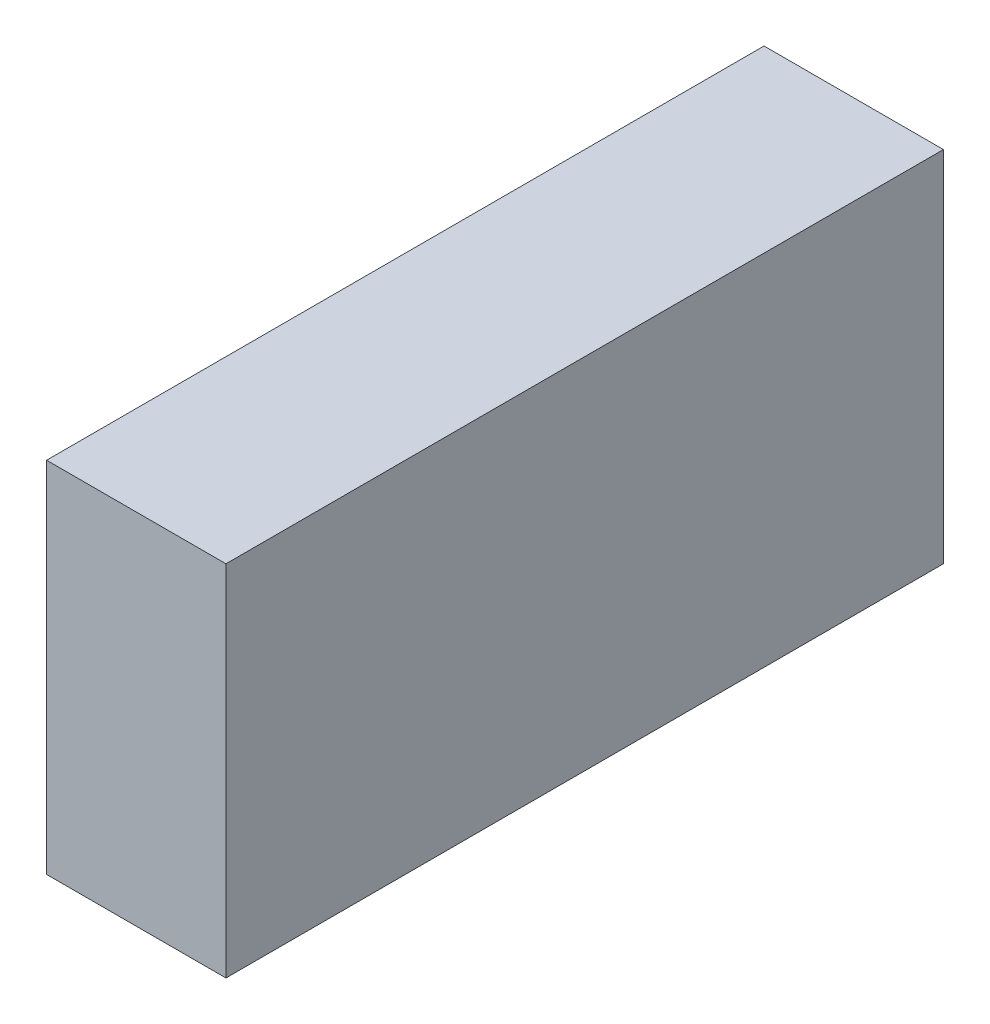
ISO-10303-21;
HEADER;
FILE_DESCRIPTION(('STEP AP214'),'2;1');
FILE_NAME('part.step','',(''),(''),'','','');
FILE_SCHEMA(('AUTOMOTIVE_DESIGN { 1 0 10303 214 1 1 1 1 }'));
ENDSEC;
DATA;
#1=APPLICATION_CONTEXT('core data for automotive mechanical design processes');
#2=APPLICATION_PROTOCOL_DEFINITION('international standard','automotive_design',2000,#1);
#3=PRODUCT_CONTEXT('',#1,'mechanical');
#4=PRODUCT('Part','Part','',(#3));
#5=PRODUCT_RELATED_PRODUCT_CATEGORY('part','',(#4));
#6=PRODUCT_DEFINITION_FORMATION('','',#4);
#7=PRODUCT_DEFINITION_CONTEXT('part definition',#1,'design');
#8=PRODUCT_DEFINITION('design','',#6,#7);
#9=PRODUCT_DEFINITION_SHAPE('','',#8);
#10=(LENGTH_UNIT() NAMED_UNIT(*) SI_UNIT(.MILLI.,.METRE.));
#11=(NAMED_UNIT(*) PLANE_ANGLE_UNIT() SI_UNIT($,.RADIAN.));
#12=(NAMED_UNIT(*) SI_UNIT($,.STERADIAN.) SOLID_ANGLE_UNIT());
#13=UNCERTAINTY_MEASURE_WITH_UNIT(LENGTH_MEASURE(1.E-05),#10,'distance_accuracy_value','');
#14=(GEOMETRIC_REPRESENTATION_CONTEXT(3) GLOBAL_UNCERTAINTY_ASSIGNED_CONTEXT((#13)) GLOBAL_UNIT_ASSIGNED_CONTEXT((#10,
#11,#12)) REPRESENTATION_CONTEXT('',''));
#15=CARTESIAN_POINT('',(0.,0.,0.));
#16=DIRECTION('',(0.,0.,1.));
#17=DIRECTION('',(1.,0.,0.));
#18=AXIS2_PLACEMENT_3D('',#15,#16,#17);
#19=CARTESIAN_POINT('',(3.175,9.525,12.7));
#20=DIRECTION('',(-1.,0.,0.));
#21=DIRECTION('',(0.,0.,1.));
#22=AXIS2_PLACEMENT_3D('',#19,#20,#21);
#23=PLANE('',#22);
#24=DIRECTION('',(0.,1.,0.));
#25=VECTOR('',#24,1.);
#26=CARTESIAN_POINT('',(3.175,9.525,-12.7));
#27=LINE('',#26,#25);
#28=CARTESIAN_POINT('',(3.175,9.525,-12.7));
#29=VERTEX_POINT('',#28);
#30=CARTESIAN_POINT('',(3.175,22.225,-12.7));
#31=VERTEX_POINT('',#30);
#32=EDGE_CURVE('E96',#29,#31,#27,.T.);
#33=ORIENTED_EDGE('',*,*,#32,.T.);
#34=DIRECTION('',(0.,0.,-1.));
#35=VECTOR('',#34,1.);
#36=CARTESIAN_POINT('',(3.175,22.225,12.7));
#37=LINE('',#36,#35);
#38=CARTESIAN_POINT('',(3.175,22.225,12.7));
#39=VERTEX_POINT('',#38);
#40=EDGE_CURVE('E11',#39,#31,#37,.T.);
#41=ORIENTED_EDGE('',*,*,#40,.F.);
#42=DIRECTION('',(0.,1.,0.));
#43=VECTOR('',#42,1.);
#44=CARTESIAN_POINT('',(3.175,9.525,12.7));
#45=LINE('',#44,#43);
#46=CARTESIAN_POINT('',(3.175,9.525,12.7));
#47=VERTEX_POINT('',#46);
#48=EDGE_CURVE('E84',#47,#39,#45,.T.);
#49=ORIENTED_EDGE('',*,*,#48,.F.);
#50=DIRECTION('',(0.,0.,-1.));
#51=VECTOR('',#50,1.);
#52=CARTESIAN_POINT('',(3.175,9.525,12.7));
#53=LINE('',#52,#51);
#54=EDGE_CURVE('E92',#47,#29,#53,.T.);
#55=ORIENTED_EDGE('',*,*,#54,.T.);
#56=EDGE_LOOP('',(#33,#41,#49,#55));
#57=FACE_BOUND('',#56,.T.);
#58=ADVANCED_FACE('F33',(#57),#23,.F.);
#59=CARTESIAN_POINT('',(-3.175,22.225,12.7));
#60=DIRECTION('',(0.,-1.,0.));
#61=DIRECTION('',(0.,0.,-1.));
#62=AXIS2_PLACEMENT_3D('',#59,#60,#61);
#63=PLANE('',#62);
#64=DIRECTION('',(-1.,0.,0.));
#65=VECTOR('',#64,1.);
#66=CARTESIAN_POINT('',(-3.175,22.225,-12.7));
#67=LINE('',#66,#65);
#68=CARTESIAN_POINT('',(-3.175,22.225,-12.7));
#69=VERTEX_POINT('',#68);
#70=EDGE_CURVE('E88',#31,#69,#67,.T.);
#71=ORIENTED_EDGE('',*,*,#70,.T.);
#72=DIRECTION('',(0.,0.,-1.));
#73=VECTOR('',#72,1.);
#74=CARTESIAN_POINT('',(-3.175,22.225,12.7));
#75=LINE('',#74,#73);
#76=CARTESIAN_POINT('',(-3.175,22.225,12.7));
#77=VERTEX_POINT('',#76);
#78=EDGE_CURVE('E41',#77,#69,#75,.T.);
#79=ORIENTED_EDGE('',*,*,#78,.F.);
#80=DIRECTION('',(-1.,0.,0.));
#81=VECTOR('',#80,1.);
#82=CARTESIAN_POINT('',(-3.175,22.225,12.7));
#83=LINE('',#82,#81);
#84=EDGE_CURVE('E79',#39,#77,#83,.T.);
#85=ORIENTED_EDGE('',*,*,#84,.F.);
#86=ORIENTED_EDGE('',*,*,#40,.T.);
#87=EDGE_LOOP('',(#71,#79,#85,#86));
#88=FACE_BOUND('',#87,.T.);
#89=ADVANCED_FACE('F87',(#88),#63,.F.);
#90=CARTESIAN_POINT('',(-3.175,9.525,12.7));
#91=DIRECTION('',(1.,0.,0.));
#92=DIRECTION('',(0.,0.,-1.));
#93=AXIS2_PLACEMENT_3D('',#90,#91,#92);
#94=PLANE('',#93);
#95=DIRECTION('',(0.,-1.,0.));
#96=VECTOR('',#95,1.);
#97=CARTESIAN_POINT('',(-3.175,9.525,-12.7));
#98=LINE('',#97,#96);
#99=CARTESIAN_POINT('',(-3.175,9.525,-12.7));
#100=VERTEX_POINT('',#99);
#101=EDGE_CURVE('E66',#69,#100,#98,.T.);
#102=ORIENTED_EDGE('',*,*,#101,.T.);
#103=DIRECTION('',(0.,0.,-1.));
#104=VECTOR('',#103,1.);
#105=CARTESIAN_POINT('',(-3.175,9.525,12.7));
#106=LINE('',#105,#104);
#107=CARTESIAN_POINT('',(-3.175,9.525,12.7));
#108=VERTEX_POINT('',#107);
#109=EDGE_CURVE('E89',#108,#100,#106,.T.);
#110=ORIENTED_EDGE('',*,*,#109,.F.);
#111=DIRECTION('',(0.,-1.,0.));
#112=VECTOR('',#111,1.);
#113=CARTESIAN_POINT('',(-3.175,9.525,12.7));
#114=LINE('',#113,#112);
#115=EDGE_CURVE('E82',#77,#108,#114,.T.);
#116=ORIENTED_EDGE('',*,*,#115,.F.);
#117=ORIENTED_EDGE('',*,*,#78,.T.);
#118=EDGE_LOOP('',(#102,#110,#116,#117));
#119=FACE_BOUND('',#118,.T.);
#120=ADVANCED_FACE('F90',(#119),#94,.F.);
#121=CARTESIAN_POINT('',(-3.175,9.525,12.7));
#122=DIRECTION('',(0.,1.,0.));
#123=DIRECTION('',(0.,0.,1.));
#124=AXIS2_PLACEMENT_3D('',#121,#122,#123);
#125=PLANE('',#124);
#126=DIRECTION('',(1.,0.,0.));
#127=VECTOR('',#126,1.);
#128=CARTESIAN_POINT('',(-3.175,9.525,-12.7));
#129=LINE('',#128,#127);
#130=EDGE_CURVE('E72',#100,#29,#129,.T.);
#131=ORIENTED_EDGE('',*,*,#130,.T.);
#132=ORIENTED_EDGE('',*,*,#54,.F.);
#133=DIRECTION('',(1.,0.,0.));
#134=VECTOR('',#133,1.);
#135=CARTESIAN_POINT('',(-3.175,9.525,12.7));
#136=LINE('',#135,#134);
#137=EDGE_CURVE('E49',#108,#47,#136,.T.);
#138=ORIENTED_EDGE('',*,*,#137,.F.);
#139=ORIENTED_EDGE('',*,*,#109,.T.);
#140=EDGE_LOOP('',(#131,#132,#138,#139));
#141=FACE_BOUND('',#140,.T.);
#142=ADVANCED_FACE('F103',(#141),#125,.F.);
#143=CARTESIAN_POINT('',(0.,0.,12.7));
#144=DIRECTION('',(0.,0.,-1.));
#145=DIRECTION('',(-1.,0.,0.));
#146=AXIS2_PLACEMENT_3D('',#143,#144,#145);
#147=PLANE('',#146);
#148=ORIENTED_EDGE('',*,*,#48,.T.);
#149=ORIENTED_EDGE('',*,*,#84,.T.);
#150=ORIENTED_EDGE('',*,*,#115,.T.);
#151=ORIENTED_EDGE('',*,*,#137,.T.);
#152=EDGE_LOOP('',(#148,#149,#150,#151));
#153=FACE_BOUND('',#152,.T.);
#154=ADVANCED_FACE('F80',(#153),#147,.F.);
#155=CARTESIAN_POINT('',(0.,0.,-12.7));
#156=DIRECTION('',(0.,0.,-1.));
#157=DIRECTION('',(-1.,0.,0.));
#158=AXIS2_PLACEMENT_3D('',#155,#156,#157);
#159=PLANE('',#158);
#160=ORIENTED_EDGE('',*,*,#32,.F.);
#161=ORIENTED_EDGE('',*,*,#130,.F.);
#162=ORIENTED_EDGE('',*,*,#101,.F.);
#163=ORIENTED_EDGE('',*,*,#70,.F.);
#164=EDGE_LOOP('',(#160,#161,#162,#163));
#165=FACE_BOUND('',#164,.T.);
#166=ADVANCED_FACE('F106',(#165),#159,.T.);
#167=CLOSED_SHELL('',(#58,#89,#120,#142,#154,#166));
#168=MANIFOLD_SOLID_BREP('B2',#167);
#169=ADVANCED_BREP_SHAPE_REPRESENTATION('',(#18,#168),#14);
#170=SHAPE_DEFINITION_REPRESENTATION(#9,#169);
ENDSEC;
END-ISO-10303-21;
